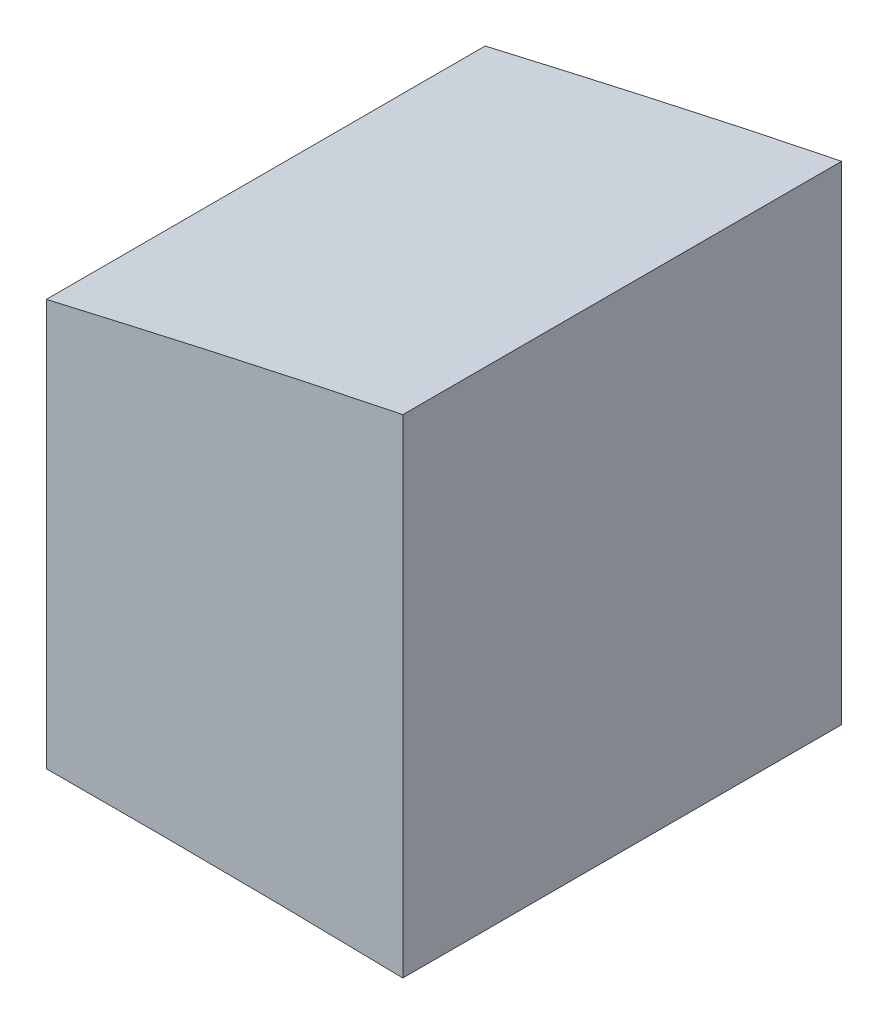
ISO-10303-21;
HEADER;
FILE_DESCRIPTION(('STEP AP214'),'2;1');
FILE_NAME('part.step','',(''),(''),'','','');
FILE_SCHEMA(('AUTOMOTIVE_DESIGN { 1 0 10303 214 1 1 1 1 }'));
ENDSEC;
DATA;
#1=APPLICATION_CONTEXT('core data for automotive mechanical design processes');
#2=APPLICATION_PROTOCOL_DEFINITION('international standard','automotive_design',2000,#1);
#3=PRODUCT_CONTEXT('',#1,'mechanical');
#4=PRODUCT('Part','Part','',(#3));
#5=PRODUCT_RELATED_PRODUCT_CATEGORY('part','',(#4));
#6=PRODUCT_DEFINITION_FORMATION('','',#4);
#7=PRODUCT_DEFINITION_CONTEXT('part definition',#1,'design');
#8=PRODUCT_DEFINITION('design','',#6,#7);
#9=PRODUCT_DEFINITION_SHAPE('','',#8);
#10=(LENGTH_UNIT() NAMED_UNIT(*) SI_UNIT(.MILLI.,.METRE.));
#11=(NAMED_UNIT(*) PLANE_ANGLE_UNIT() SI_UNIT($,.RADIAN.));
#12=(NAMED_UNIT(*) SI_UNIT($,.STERADIAN.) SOLID_ANGLE_UNIT());
#13=UNCERTAINTY_MEASURE_WITH_UNIT(LENGTH_MEASURE(1.E-05),#10,'distance_accuracy_value','');
#14=(GEOMETRIC_REPRESENTATION_CONTEXT(3) GLOBAL_UNCERTAINTY_ASSIGNED_CONTEXT((#13)) GLOBAL_UNIT_ASSIGNED_CONTEXT((#10,
#11,#12)) REPRESENTATION_CONTEXT('',''));
#15=CARTESIAN_POINT('',(0.,0.,0.));
#16=DIRECTION('',(0.,0.,1.));
#17=DIRECTION('',(1.,0.,0.));
#18=AXIS2_PLACEMENT_3D('',#15,#16,#17);
#19=CARTESIAN_POINT('',(6.23690674710793,-9.83282120050422,22.225));
#20=DIRECTION('',(0.,0.,1.));
#21=DIRECTION('',(1.,0.,0.));
#22=AXIS2_PLACEMENT_3D('',#19,#20,#21);
#23=PLANE('',#22);
#24=DIRECTION('',(0.,-1.,0.));
#25=VECTOR('',#24,1.);
#26=CARTESIAN_POINT('',(-47.9510549303898,30.6925003680842,22.225));
#27=LINE('',#26,#25);
#28=CARTESIAN_POINT('',(-47.9510549303898,18.9247222411647,22.225));
#29=VERTEX_POINT('',#28);
#30=CARTESIAN_POINT('',(-47.9510549303898,-5.78451429799937,22.225));
#31=VERTEX_POINT('',#30);
#32=EDGE_CURVE('E187',#29,#31,#27,.T.);
#33=ORIENTED_EDGE('',*,*,#32,.F.);
#34=CARTESIAN_POINT('',(76.2169962626333,-12.3082935907539,22.225));
#35=CARTESIAN_POINT('',(75.6069525390447,-6.76655965764841,22.225));
#36=CARTESIAN_POINT('',(69.7043006889504,1.13838920453428,22.225));
#37=CARTESIAN_POINT('',(56.4222366314094,10.2643835983855,22.225));
#38=CARTESIAN_POINT('',(36.9761031047391,19.3707728361886,22.225));
#39=CARTESIAN_POINT('',(8.74168720896823,24.8154039567916,22.225));
#40=CARTESIAN_POINT('',(-27.455234983126,23.566672909106,22.225));
#41=CARTESIAN_POINT('',(-52.387628687855,18.1036316509052,22.225));
#42=CARTESIAN_POINT('',(-66.0069716290183,14.9523239686121,22.225));
#43=B_SPLINE_CURVE_WITH_KNOTS('',3,(#34,#35,#36,#37,#38,#39,#40,#41,#42),.UNSPECIFIED.,.F.,.F.,
(4,1,1,1,1,1,4),(0.,0.0865869930935198,0.16173742787457,0.268322265449627,0.445156626621206,
0.638028872876503,0.87237087622276),.UNSPECIFIED.);
#44=CARTESIAN_POINT('',(-66.0069716290183,14.9523239686121,22.225));
#45=VERTEX_POINT('',#44);
#46=EDGE_CURVE('E119',#29,#45,#43,.T.);
#47=ORIENTED_EDGE('',*,*,#46,.T.);
#48=DIRECTION('',(0.,-1.,0.));
#49=VECTOR('',#48,1.);
#50=CARTESIAN_POINT('',(-66.0069716290183,14.9523239686121,22.225));
#51=LINE('',#50,#49);
#52=CARTESIAN_POINT('',(-66.0069716290183,-5.63470862311888,22.225));
#53=VERTEX_POINT('',#52);
#54=EDGE_CURVE('E64',#45,#53,#51,.T.);
#55=ORIENTED_EDGE('',*,*,#54,.T.);
#56=CARTESIAN_POINT('',(-66.0069716290183,-5.63470862311887,22.225));
#57=CARTESIAN_POINT('',(-44.5940371879975,-5.53917687984291,22.225));
#58=CARTESIAN_POINT('',(-13.0130223079607,-6.72409850193042,22.225));
#59=CARTESIAN_POINT('',(26.1366565690305,-12.7508567541694,22.225));
#60=CARTESIAN_POINT('',(48.7652674229662,-16.9007642038902,22.225));
#61=CARTESIAN_POINT('',(64.6833626627234,-16.9690523934929,22.225));
#62=CARTESIAN_POINT('',(75.2906304926915,-17.5225292184952,22.225));
#63=CARTESIAN_POINT('',(76.2169962626333,-12.3082935907539,22.225));
#64=B_SPLINE_CURVE_WITH_KNOTS('',3,(#56,#57,#58,#59,#60,#61,#62,#63),.UNSPECIFIED.,.F.,.F.,(4,1,
1,1,1,4),(0.133250971952972,0.517329721776624,0.696666541434988,0.84940993817877,
0.919519723249622,1.),.UNSPECIFIED.);
#65=EDGE_CURVE('E87',#53,#31,#64,.T.);
#66=ORIENTED_EDGE('',*,*,#65,.T.);
#67=EDGE_LOOP('',(#33,#47,#55,#66));
#68=FACE_BOUND('',#67,.T.);
#69=ADVANCED_FACE('F39',(#68),#23,.T.);
#70=CARTESIAN_POINT('',(6.23690674710793,-9.83282120050422,0.));
#71=DIRECTION('',(0.,0.,1.));
#72=DIRECTION('',(1.,0.,0.));
#73=AXIS2_PLACEMENT_3D('',#70,#71,#72);
#74=PLANE('',#73);
#75=CARTESIAN_POINT('',(76.2169962626333,-12.3082935907539,0.));
#76=CARTESIAN_POINT('',(75.6069525390447,-6.76655965764841,0.));
#77=CARTESIAN_POINT('',(69.7043006889504,1.13838920453428,0.));
#78=CARTESIAN_POINT('',(56.4222366314094,10.2643835983855,0.));
#79=CARTESIAN_POINT('',(36.9761031047391,19.3707728361886,0.));
#80=CARTESIAN_POINT('',(8.74168720896823,24.8154039567916,0.));
#81=CARTESIAN_POINT('',(-27.455234983126,23.566672909106,0.));
#82=CARTESIAN_POINT('',(-52.387628687855,18.1036316509052,0.));
#83=CARTESIAN_POINT('',(-66.0069716290183,14.9523239686121,0.));
#84=B_SPLINE_CURVE_WITH_KNOTS('',3,(#75,#76,#77,#78,#79,#80,#81,#82,#83),.UNSPECIFIED.,.F.,.F.,
(4,1,1,1,1,1,4),(0.,0.0865869930935198,0.16173742787457,0.268322265449627,0.445156626621206,
0.638028872876503,0.87237087622276),.UNSPECIFIED.);
#85=CARTESIAN_POINT('',(-47.9510549303898,18.9247222430527,0.));
#86=VERTEX_POINT('',#85);
#87=CARTESIAN_POINT('',(-66.0069716290183,14.9523239686121,0.));
#88=VERTEX_POINT('',#87);
#89=EDGE_CURVE('E88',#86,#88,#84,.T.);
#90=ORIENTED_EDGE('',*,*,#89,.F.);
#91=DIRECTION('',(0.,-1.,0.));
#92=VECTOR('',#91,1.);
#93=CARTESIAN_POINT('',(-47.9510549303897,-9.83282120050423,0.));
#94=LINE('',#93,#92);
#95=CARTESIAN_POINT('',(-47.9510549303897,-5.78451429799937,0.));
#96=VERTEX_POINT('',#95);
#97=EDGE_CURVE('E56',#86,#96,#94,.T.);
#98=ORIENTED_EDGE('',*,*,#97,.T.);
#99=CARTESIAN_POINT('',(-66.0069716290183,-5.63470862311887,0.));
#100=CARTESIAN_POINT('',(-44.5940371879975,-5.53917687984291,0.));
#101=CARTESIAN_POINT('',(-13.0130223079607,-6.72409850193042,0.));
#102=CARTESIAN_POINT('',(26.1366565690305,-12.7508567541694,0.));
#103=CARTESIAN_POINT('',(48.7652674229662,-16.9007642038902,0.));
#104=CARTESIAN_POINT('',(64.6833626627234,-16.9690523934929,0.));
#105=CARTESIAN_POINT('',(75.2906304926915,-17.5225292184952,0.));
#106=CARTESIAN_POINT('',(76.2169962626333,-12.3082935907539,0.));
#107=B_SPLINE_CURVE_WITH_KNOTS('',3,(#99,#100,#101,#102,#103,#104,#105,#106),.UNSPECIFIED.,.F.,
.F.,(4,1,1,1,1,4),(0.133250971952972,0.517329721776624,0.696666541434988,0.84940993817877,
0.919519723249622,1.),.UNSPECIFIED.);
#108=CARTESIAN_POINT('',(-66.0069716290183,-5.63470862311888,0.));
#109=VERTEX_POINT('',#108);
#110=EDGE_CURVE('E93',#109,#96,#107,.T.);
#111=ORIENTED_EDGE('',*,*,#110,.F.);
#112=DIRECTION('',(0.,-1.,0.));
#113=VECTOR('',#112,1.);
#114=CARTESIAN_POINT('',(-66.0069716290183,14.9523239686121,0.));
#115=LINE('',#114,#113);
#116=EDGE_CURVE('E77',#88,#109,#115,.T.);
#117=ORIENTED_EDGE('',*,*,#116,.F.);
#118=EDGE_LOOP('',(#90,#98,#111,#117));
#119=FACE_BOUND('',#118,.T.);
#120=ADVANCED_FACE('F96',(#119),#74,.F.);
#121=DIRECTION('',(0.,0.,-1.));
#122=VECTOR('',#121,1.);
#123=SURFACE_OF_LINEAR_EXTRUSION('',#64,#122);
#124=ORIENTED_EDGE('',*,*,#110,.T.);
#125=DIRECTION('',(0.,0.,-1.));
#126=VECTOR('',#125,1.);
#127=CARTESIAN_POINT('',(-47.9510549303897,-5.7845142978359,22.225));
#128=LINE('',#127,#126);
#129=EDGE_CURVE('E98',#96,#31,#128,.F.);
#130=ORIENTED_EDGE('',*,*,#129,.T.);
#131=ORIENTED_EDGE('',*,*,#65,.F.);
#132=DIRECTION('',(0.,0.,-1.));
#133=VECTOR('',#132,1.);
#134=CARTESIAN_POINT('',(-66.0069716290183,-5.63470862311888,22.225));
#135=LINE('',#134,#133);
#136=EDGE_CURVE('E80',#53,#109,#135,.T.);
#137=ORIENTED_EDGE('',*,*,#136,.T.);
#138=EDGE_LOOP('',(#124,#130,#131,#137));
#139=FACE_BOUND('',#138,.T.);
#140=ADVANCED_FACE('F41',(#139),#123,.F.);
#141=DIRECTION('',(0.,0.,-1.));
#142=VECTOR('',#141,1.);
#143=SURFACE_OF_LINEAR_EXTRUSION('',#43,#142);
#144=ORIENTED_EDGE('',*,*,#46,.F.);
#145=DIRECTION('',(0.,0.,-1.));
#146=VECTOR('',#145,1.);
#147=CARTESIAN_POINT('',(-47.9510549303898,18.9247222430527,22.225));
#148=LINE('',#147,#146);
#149=EDGE_CURVE('E11',#29,#86,#148,.T.);
#150=ORIENTED_EDGE('',*,*,#149,.T.);
#151=ORIENTED_EDGE('',*,*,#89,.T.);
#152=DIRECTION('',(0.,0.,-1.));
#153=VECTOR('',#152,1.);
#154=CARTESIAN_POINT('',(-66.0069716290183,14.9523239686121,22.225));
#155=LINE('',#154,#153);
#156=EDGE_CURVE('E49',#45,#88,#155,.T.);
#157=ORIENTED_EDGE('',*,*,#156,.F.);
#158=EDGE_LOOP('',(#144,#150,#151,#157));
#159=FACE_BOUND('',#158,.T.);
#160=ADVANCED_FACE('F136',(#159),#143,.F.);
#161=CARTESIAN_POINT('',(-66.0069716290183,14.9523239686121,22.225));
#162=DIRECTION('',(1.,0.,0.));
#163=DIRECTION('',(0.,1.,0.));
#164=AXIS2_PLACEMENT_3D('',#161,#162,#163);
#165=PLANE('',#164);
#166=ORIENTED_EDGE('',*,*,#116,.T.);
#167=ORIENTED_EDGE('',*,*,#136,.F.);
#168=ORIENTED_EDGE('',*,*,#54,.F.);
#169=ORIENTED_EDGE('',*,*,#156,.T.);
#170=EDGE_LOOP('',(#166,#167,#168,#169));
#171=FACE_BOUND('',#170,.T.);
#172=ADVANCED_FACE('F79',(#171),#165,.F.);
#173=CARTESIAN_POINT('',(-47.9510549303898,30.6925003680842,-6.731));
#174=DIRECTION('',(-1.,0.,0.));
#175=DIRECTION('',(0.,-1.,0.));
#176=AXIS2_PLACEMENT_3D('',#173,#174,#175);
#177=PLANE('',#176);
#178=ORIENTED_EDGE('',*,*,#97,.F.);
#179=ORIENTED_EDGE('',*,*,#149,.F.);
#180=ORIENTED_EDGE('',*,*,#32,.T.);
#181=ORIENTED_EDGE('',*,*,#129,.F.);
#182=EDGE_LOOP('',(#178,#179,#180,#181));
#183=FACE_BOUND('',#182,.T.);
#184=ADVANCED_FACE('F142',(#183),#177,.F.);
#185=CLOSED_SHELL('',(#69,#120,#140,#160,#172,#184));
#186=MANIFOLD_SOLID_BREP('B2',#185);
#187=ADVANCED_BREP_SHAPE_REPRESENTATION('',(#18,#186),#14);
#188=SHAPE_DEFINITION_REPRESENTATION(#9,#187);
ENDSEC;
END-ISO-10303-21;
